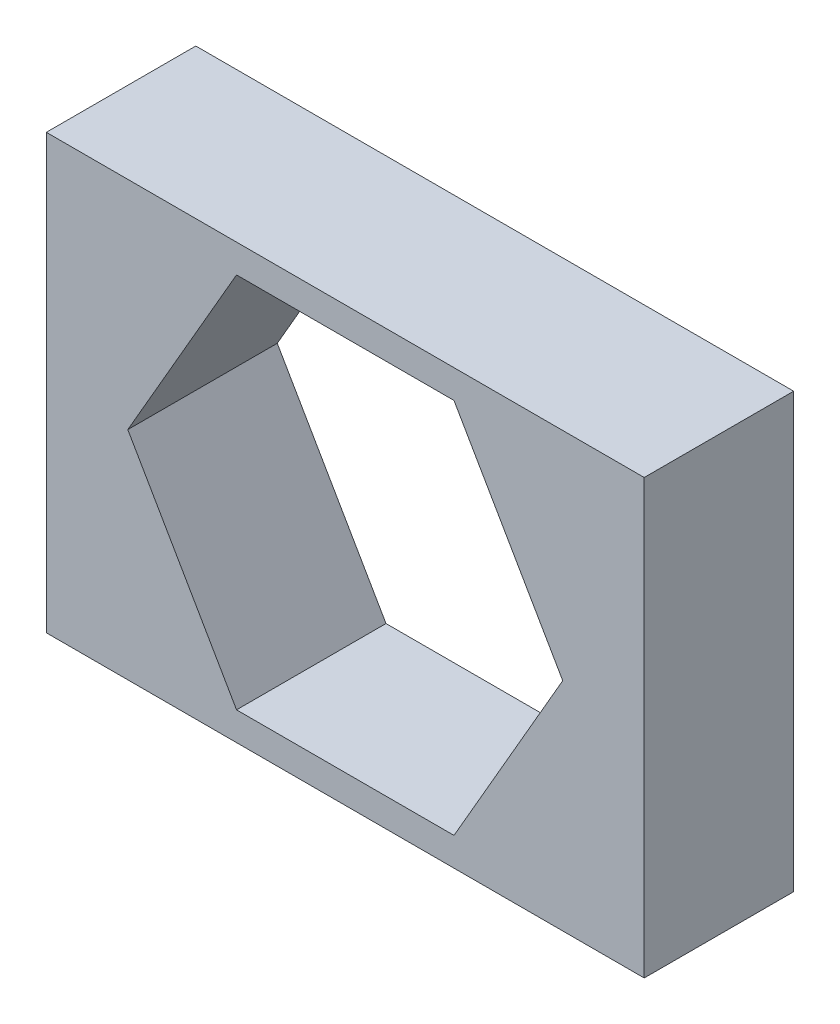
ISO-10303-21;
HEADER;
FILE_DESCRIPTION(('STEP AP214'),'2;1');
FILE_NAME('part.step','',(''),(''),'','','');
FILE_SCHEMA(('AUTOMOTIVE_DESIGN { 1 0 10303 214 1 1 1 1 }'));
ENDSEC;
DATA;
#1=APPLICATION_CONTEXT('core data for automotive mechanical design processes');
#2=APPLICATION_PROTOCOL_DEFINITION('international standard','automotive_design',2000,#1);
#3=PRODUCT_CONTEXT('',#1,'mechanical');
#4=PRODUCT('Part','Part','',(#3));
#5=PRODUCT_RELATED_PRODUCT_CATEGORY('part','',(#4));
#6=PRODUCT_DEFINITION_FORMATION('','',#4);
#7=PRODUCT_DEFINITION_CONTEXT('part definition',#1,'design');
#8=PRODUCT_DEFINITION('design','',#6,#7);
#9=PRODUCT_DEFINITION_SHAPE('','',#8);
#10=(LENGTH_UNIT() NAMED_UNIT(*) SI_UNIT(.MILLI.,.METRE.));
#11=(NAMED_UNIT(*) PLANE_ANGLE_UNIT() SI_UNIT($,.RADIAN.));
#12=(NAMED_UNIT(*) SI_UNIT($,.STERADIAN.) SOLID_ANGLE_UNIT());
#13=UNCERTAINTY_MEASURE_WITH_UNIT(LENGTH_MEASURE(1.E-05),#10,'distance_accuracy_value','');
#14=(GEOMETRIC_REPRESENTATION_CONTEXT(3) GLOBAL_UNCERTAINTY_ASSIGNED_CONTEXT((#13)) GLOBAL_UNIT_ASSIGNED_CONTEXT((#10,
#11,#12)) REPRESENTATION_CONTEXT('',''));
#15=CARTESIAN_POINT('',(0.,0.,0.));
#16=DIRECTION('',(0.,0.,1.));
#17=DIRECTION('',(1.,0.,0.));
#18=AXIS2_PLACEMENT_3D('',#15,#16,#17);
#19=CARTESIAN_POINT('',(0.,0.,5.));
#20=DIRECTION('',(0.,0.,-1.));
#21=DIRECTION('',(-1.,0.,0.));
#22=AXIS2_PLACEMENT_3D('',#19,#20,#21);
#23=PLANE('',#22);
#24=DIRECTION('',(0.,-1.,0.));
#25=VECTOR('',#24,1.);
#26=CARTESIAN_POINT('',(0.,0.,5.));
#27=LINE('',#26,#25);
#28=CARTESIAN_POINT('',(0.,14.5,5.));
#29=VERTEX_POINT('',#28);
#30=CARTESIAN_POINT('',(0.,0.,5.));
#31=VERTEX_POINT('',#30);
#32=EDGE_CURVE('E161',#29,#31,#27,.T.);
#33=ORIENTED_EDGE('',*,*,#32,.T.);
#34=DIRECTION('',(1.,0.,0.));
#35=VECTOR('',#34,1.);
#36=CARTESIAN_POINT('',(0.,0.,5.));
#37=LINE('',#36,#35);
#38=CARTESIAN_POINT('',(20.,0.,5.));
#39=VERTEX_POINT('',#38);
#40=EDGE_CURVE('E164',#31,#39,#37,.T.);
#41=ORIENTED_EDGE('',*,*,#40,.T.);
#42=DIRECTION('',(0.,1.,0.));
#43=VECTOR('',#42,1.);
#44=CARTESIAN_POINT('',(20.,0.,5.));
#45=LINE('',#44,#43);
#46=CARTESIAN_POINT('',(20.,14.5,5.));
#47=VERTEX_POINT('',#46);
#48=EDGE_CURVE('E167',#39,#47,#45,.T.);
#49=ORIENTED_EDGE('',*,*,#48,.T.);
#50=DIRECTION('',(-1.,0.,0.));
#51=VECTOR('',#50,1.);
#52=CARTESIAN_POINT('',(0.,14.5,5.));
#53=LINE('',#52,#51);
#54=EDGE_CURVE('E169',#47,#29,#53,.T.);
#55=ORIENTED_EDGE('',*,*,#54,.T.);
#56=EDGE_LOOP('',(#33,#41,#49,#55));
#57=FACE_BOUND('',#56,.T.);
#58=DIRECTION('',(0.5,0.866025403784439,0.));
#59=VECTOR('',#58,1.);
#60=CARTESIAN_POINT('',(13.6373066958946,0.949999999999997,5.));
#61=LINE('',#60,#59);
#62=CARTESIAN_POINT('',(13.6373066958946,0.949999999999997,5.));
#63=VERTEX_POINT('',#62);
#64=CARTESIAN_POINT('',(17.2746133917893,7.25,5.));
#65=VERTEX_POINT('',#64);
#66=EDGE_CURVE('E110',#63,#65,#61,.T.);
#67=ORIENTED_EDGE('',*,*,#66,.F.);
#68=DIRECTION('',(1.,0.,0.));
#69=VECTOR('',#68,1.);
#70=CARTESIAN_POINT('',(6.36269330410535,0.950000000000003,5.));
#71=LINE('',#70,#69);
#72=CARTESIAN_POINT('',(6.36269330410535,0.950000000000003,5.));
#73=VERTEX_POINT('',#72);
#74=EDGE_CURVE('E139',#73,#63,#71,.T.);
#75=ORIENTED_EDGE('',*,*,#74,.F.);
#76=DIRECTION('',(0.5,-0.866025403784439,0.));
#77=VECTOR('',#76,1.);
#78=CARTESIAN_POINT('',(2.72538660821072,7.25,5.));
#79=LINE('',#78,#77);
#80=CARTESIAN_POINT('',(2.72538660821072,7.25,5.));
#81=VERTEX_POINT('',#80);
#82=EDGE_CURVE('E137',#81,#73,#79,.T.);
#83=ORIENTED_EDGE('',*,*,#82,.F.);
#84=DIRECTION('',(-0.5,-0.866025403784438,0.));
#85=VECTOR('',#84,1.);
#86=CARTESIAN_POINT('',(6.36269330410536,13.55,5.));
#87=LINE('',#86,#85);
#88=CARTESIAN_POINT('',(6.36269330410536,13.55,5.));
#89=VERTEX_POINT('',#88);
#90=EDGE_CURVE('E133',#89,#81,#87,.T.);
#91=ORIENTED_EDGE('',*,*,#90,.F.);
#92=DIRECTION('',(-1.,0.,0.));
#93=VECTOR('',#92,1.);
#94=CARTESIAN_POINT('',(13.6373066958946,13.55,5.));
#95=LINE('',#94,#93);
#96=CARTESIAN_POINT('',(13.6373066958946,13.55,5.));
#97=VERTEX_POINT('',#96);
#98=EDGE_CURVE('E131',#97,#89,#95,.T.);
#99=ORIENTED_EDGE('',*,*,#98,.F.);
#100=DIRECTION('',(-0.5,0.866025403784439,0.));
#101=VECTOR('',#100,1.);
#102=CARTESIAN_POINT('',(17.2746133917893,7.25,5.));
#103=LINE('',#102,#101);
#104=EDGE_CURVE('E118',#65,#97,#103,.T.);
#105=ORIENTED_EDGE('',*,*,#104,.F.);
#106=EDGE_LOOP('',(#67,#75,#83,#91,#99,#105));
#107=FACE_BOUND('',#106,.T.);
#108=ADVANCED_FACE('F33',(#57,#107),#23,.F.);
#109=CARTESIAN_POINT('',(0.,0.,0.));
#110=DIRECTION('',(0.,0.,-1.));
#111=DIRECTION('',(-1.,0.,0.));
#112=AXIS2_PLACEMENT_3D('',#109,#110,#111);
#113=PLANE('',#112);
#114=DIRECTION('',(0.,-1.,0.));
#115=VECTOR('',#114,1.);
#116=CARTESIAN_POINT('',(0.,0.,0.));
#117=LINE('',#116,#115);
#118=CARTESIAN_POINT('',(0.,14.5,0.));
#119=VERTEX_POINT('',#118);
#120=CARTESIAN_POINT('',(0.,0.,0.));
#121=VERTEX_POINT('',#120);
#122=EDGE_CURVE('E126',#119,#121,#117,.T.);
#123=ORIENTED_EDGE('',*,*,#122,.F.);
#124=DIRECTION('',(-1.,0.,0.));
#125=VECTOR('',#124,1.);
#126=CARTESIAN_POINT('',(0.,14.5,0.));
#127=LINE('',#126,#125);
#128=CARTESIAN_POINT('',(20.,14.5,0.));
#129=VERTEX_POINT('',#128);
#130=EDGE_CURVE('E165',#129,#119,#127,.T.);
#131=ORIENTED_EDGE('',*,*,#130,.F.);
#132=DIRECTION('',(0.,1.,0.));
#133=VECTOR('',#132,1.);
#134=CARTESIAN_POINT('',(20.,0.,0.));
#135=LINE('',#134,#133);
#136=CARTESIAN_POINT('',(20.,0.,0.));
#137=VERTEX_POINT('',#136);
#138=EDGE_CURVE('E176',#137,#129,#135,.T.);
#139=ORIENTED_EDGE('',*,*,#138,.F.);
#140=DIRECTION('',(1.,0.,0.));
#141=VECTOR('',#140,1.);
#142=CARTESIAN_POINT('',(0.,0.,0.));
#143=LINE('',#142,#141);
#144=EDGE_CURVE('E174',#121,#137,#143,.T.);
#145=ORIENTED_EDGE('',*,*,#144,.F.);
#146=EDGE_LOOP('',(#123,#131,#139,#145));
#147=FACE_BOUND('',#146,.T.);
#148=DIRECTION('',(1.,0.,0.));
#149=VECTOR('',#148,1.);
#150=CARTESIAN_POINT('',(6.36269330410535,0.950000000000003,0.));
#151=LINE('',#150,#149);
#152=CARTESIAN_POINT('',(6.36269330410535,0.950000000000003,0.));
#153=VERTEX_POINT('',#152);
#154=CARTESIAN_POINT('',(13.6373066958946,0.949999999999997,0.));
#155=VERTEX_POINT('',#154);
#156=EDGE_CURVE('E119',#153,#155,#151,.T.);
#157=ORIENTED_EDGE('',*,*,#156,.T.);
#158=DIRECTION('',(0.5,0.866025403784439,0.));
#159=VECTOR('',#158,1.);
#160=CARTESIAN_POINT('',(13.6373066958946,0.949999999999997,0.));
#161=LINE('',#160,#159);
#162=CARTESIAN_POINT('',(17.2746133917893,7.25,0.));
#163=VERTEX_POINT('',#162);
#164=EDGE_CURVE('E56',#155,#163,#161,.T.);
#165=ORIENTED_EDGE('',*,*,#164,.T.);
#166=DIRECTION('',(-0.5,0.866025403784439,0.));
#167=VECTOR('',#166,1.);
#168=CARTESIAN_POINT('',(17.2746133917893,7.25,0.));
#169=LINE('',#168,#167);
#170=CARTESIAN_POINT('',(13.6373066958946,13.55,0.));
#171=VERTEX_POINT('',#170);
#172=EDGE_CURVE('E125',#163,#171,#169,.T.);
#173=ORIENTED_EDGE('',*,*,#172,.T.);
#174=DIRECTION('',(-1.,0.,0.));
#175=VECTOR('',#174,1.);
#176=CARTESIAN_POINT('',(13.6373066958946,13.55,0.));
#177=LINE('',#176,#175);
#178=CARTESIAN_POINT('',(6.36269330410536,13.55,0.));
#179=VERTEX_POINT('',#178);
#180=EDGE_CURVE('E143',#171,#179,#177,.T.);
#181=ORIENTED_EDGE('',*,*,#180,.T.);
#182=DIRECTION('',(-0.5,-0.866025403784438,0.));
#183=VECTOR('',#182,1.);
#184=CARTESIAN_POINT('',(6.36269330410536,13.55,0.));
#185=LINE('',#184,#183);
#186=CARTESIAN_POINT('',(2.72538660821072,7.25,0.));
#187=VERTEX_POINT('',#186);
#188=EDGE_CURVE('E146',#179,#187,#185,.T.);
#189=ORIENTED_EDGE('',*,*,#188,.T.);
#190=DIRECTION('',(0.5,-0.866025403784439,0.));
#191=VECTOR('',#190,1.);
#192=CARTESIAN_POINT('',(2.72538660821072,7.25,0.));
#193=LINE('',#192,#191);
#194=EDGE_CURVE('E149',#187,#153,#193,.T.);
#195=ORIENTED_EDGE('',*,*,#194,.T.);
#196=EDGE_LOOP('',(#157,#165,#173,#181,#189,#195));
#197=FACE_BOUND('',#196,.T.);
#198=ADVANCED_FACE('F194',(#147,#197),#113,.T.);
#199=CARTESIAN_POINT('',(0.,0.,5.));
#200=DIRECTION('',(1.,0.,0.));
#201=DIRECTION('',(0.,1.,0.));
#202=AXIS2_PLACEMENT_3D('',#199,#200,#201);
#203=PLANE('',#202);
#204=ORIENTED_EDGE('',*,*,#122,.T.);
#205=DIRECTION('',(0.,0.,-1.));
#206=VECTOR('',#205,1.);
#207=CARTESIAN_POINT('',(0.,0.,5.));
#208=LINE('',#207,#206);
#209=EDGE_CURVE('E11',#31,#121,#208,.T.);
#210=ORIENTED_EDGE('',*,*,#209,.F.);
#211=ORIENTED_EDGE('',*,*,#32,.F.);
#212=DIRECTION('',(0.,0.,-1.));
#213=VECTOR('',#212,1.);
#214=CARTESIAN_POINT('',(0.,14.5,5.));
#215=LINE('',#214,#213);
#216=EDGE_CURVE('E171',#29,#119,#215,.T.);
#217=ORIENTED_EDGE('',*,*,#216,.T.);
#218=EDGE_LOOP('',(#204,#210,#211,#217));
#219=FACE_BOUND('',#218,.T.);
#220=ADVANCED_FACE('F35',(#219),#203,.F.);
#221=CARTESIAN_POINT('',(0.,0.,5.));
#222=DIRECTION('',(0.,1.,0.));
#223=DIRECTION('',(-1.,0.,0.));
#224=AXIS2_PLACEMENT_3D('',#221,#222,#223);
#225=PLANE('',#224);
#226=ORIENTED_EDGE('',*,*,#144,.T.);
#227=DIRECTION('',(0.,0.,-1.));
#228=VECTOR('',#227,1.);
#229=CARTESIAN_POINT('',(20.,0.,5.));
#230=LINE('',#229,#228);
#231=EDGE_CURVE('E41',#39,#137,#230,.T.);
#232=ORIENTED_EDGE('',*,*,#231,.F.);
#233=ORIENTED_EDGE('',*,*,#40,.F.);
#234=ORIENTED_EDGE('',*,*,#209,.T.);
#235=EDGE_LOOP('',(#226,#232,#233,#234));
#236=FACE_BOUND('',#235,.T.);
#237=ADVANCED_FACE('F204',(#236),#225,.F.);
#238=CARTESIAN_POINT('',(20.,0.,5.));
#239=DIRECTION('',(-1.,0.,0.));
#240=DIRECTION('',(0.,0.,1.));
#241=AXIS2_PLACEMENT_3D('',#238,#239,#240);
#242=PLANE('',#241);
#243=ORIENTED_EDGE('',*,*,#138,.T.);
#244=DIRECTION('',(0.,0.,-1.));
#245=VECTOR('',#244,1.);
#246=CARTESIAN_POINT('',(20.,14.5,5.));
#247=LINE('',#246,#245);
#248=EDGE_CURVE('E181',#47,#129,#247,.T.);
#249=ORIENTED_EDGE('',*,*,#248,.F.);
#250=ORIENTED_EDGE('',*,*,#48,.F.);
#251=ORIENTED_EDGE('',*,*,#231,.T.);
#252=EDGE_LOOP('',(#243,#249,#250,#251));
#253=FACE_BOUND('',#252,.T.);
#254=ADVANCED_FACE('F188',(#253),#242,.F.);
#255=CARTESIAN_POINT('',(0.,14.5,5.));
#256=DIRECTION('',(0.,-1.,0.));
#257=DIRECTION('',(0.,0.,-1.));
#258=AXIS2_PLACEMENT_3D('',#255,#256,#257);
#259=PLANE('',#258);
#260=ORIENTED_EDGE('',*,*,#130,.T.);
#261=ORIENTED_EDGE('',*,*,#216,.F.);
#262=ORIENTED_EDGE('',*,*,#54,.F.);
#263=ORIENTED_EDGE('',*,*,#248,.T.);
#264=EDGE_LOOP('',(#260,#261,#262,#263));
#265=FACE_BOUND('',#264,.T.);
#266=ADVANCED_FACE('F198',(#265),#259,.F.);
#267=CARTESIAN_POINT('',(13.6373066958946,0.949999999999997,5.));
#268=DIRECTION('',(-0.866025403784439,0.5,0.));
#269=DIRECTION('',(-0.5,-0.866025403784439,0.));
#270=AXIS2_PLACEMENT_3D('',#267,#268,#269);
#271=PLANE('',#270);
#272=ORIENTED_EDGE('',*,*,#164,.F.);
#273=DIRECTION('',(0.,0.,-1.));
#274=VECTOR('',#273,1.);
#275=CARTESIAN_POINT('',(13.6373066958946,0.949999999999997,5.));
#276=LINE('',#275,#274);
#277=EDGE_CURVE('E114',#63,#155,#276,.T.);
#278=ORIENTED_EDGE('',*,*,#277,.F.);
#279=ORIENTED_EDGE('',*,*,#66,.T.);
#280=DIRECTION('',(0.,0.,-1.));
#281=VECTOR('',#280,1.);
#282=CARTESIAN_POINT('',(17.2746133917893,7.25,5.));
#283=LINE('',#282,#281);
#284=EDGE_CURVE('E113',#65,#163,#283,.T.);
#285=ORIENTED_EDGE('',*,*,#284,.T.);
#286=EDGE_LOOP('',(#272,#278,#279,#285));
#287=FACE_BOUND('',#286,.T.);
#288=ADVANCED_FACE('F112',(#287),#271,.T.);
#289=CARTESIAN_POINT('',(17.2746133917893,7.25,5.));
#290=DIRECTION('',(-0.866025403784439,-0.5,0.));
#291=DIRECTION('',(0.5,-0.866025403784439,0.));
#292=AXIS2_PLACEMENT_3D('',#289,#290,#291);
#293=PLANE('',#292);
#294=ORIENTED_EDGE('',*,*,#172,.F.);
#295=ORIENTED_EDGE('',*,*,#284,.F.);
#296=ORIENTED_EDGE('',*,*,#104,.T.);
#297=DIRECTION('',(0.,0.,-1.));
#298=VECTOR('',#297,1.);
#299=CARTESIAN_POINT('',(13.6373066958946,13.55,5.));
#300=LINE('',#299,#298);
#301=EDGE_CURVE('E127',#97,#171,#300,.T.);
#302=ORIENTED_EDGE('',*,*,#301,.T.);
#303=EDGE_LOOP('',(#294,#295,#296,#302));
#304=FACE_BOUND('',#303,.T.);
#305=ADVANCED_FACE('F122',(#304),#293,.T.);
#306=CARTESIAN_POINT('',(13.6373066958946,13.55,5.));
#307=DIRECTION('',(0.,-1.,0.));
#308=DIRECTION('',(1.,0.,0.));
#309=AXIS2_PLACEMENT_3D('',#306,#307,#308);
#310=PLANE('',#309);
#311=ORIENTED_EDGE('',*,*,#180,.F.);
#312=ORIENTED_EDGE('',*,*,#301,.F.);
#313=ORIENTED_EDGE('',*,*,#98,.T.);
#314=DIRECTION('',(0.,0.,-1.));
#315=VECTOR('',#314,1.);
#316=CARTESIAN_POINT('',(6.36269330410536,13.55,5.));
#317=LINE('',#316,#315);
#318=EDGE_CURVE('E158',#89,#179,#317,.T.);
#319=ORIENTED_EDGE('',*,*,#318,.T.);
#320=EDGE_LOOP('',(#311,#312,#313,#319));
#321=FACE_BOUND('',#320,.T.);
#322=ADVANCED_FACE('F227',(#321),#310,.T.);
#323=CARTESIAN_POINT('',(6.36269330410536,13.55,5.));
#324=DIRECTION('',(0.866025403784438,-0.5,0.));
#325=DIRECTION('',(0.5,0.866025403784438,0.));
#326=AXIS2_PLACEMENT_3D('',#323,#324,#325);
#327=PLANE('',#326);
#328=ORIENTED_EDGE('',*,*,#188,.F.);
#329=ORIENTED_EDGE('',*,*,#318,.F.);
#330=ORIENTED_EDGE('',*,*,#90,.T.);
#331=DIRECTION('',(0.,0.,-1.));
#332=VECTOR('',#331,1.);
#333=CARTESIAN_POINT('',(2.72538660821072,7.25,5.));
#334=LINE('',#333,#332);
#335=EDGE_CURVE('E156',#81,#187,#334,.T.);
#336=ORIENTED_EDGE('',*,*,#335,.T.);
#337=EDGE_LOOP('',(#328,#329,#330,#336));
#338=FACE_BOUND('',#337,.T.);
#339=ADVANCED_FACE('F231',(#338),#327,.T.);
#340=CARTESIAN_POINT('',(2.72538660821072,7.25,5.));
#341=DIRECTION('',(0.866025403784439,0.5,0.));
#342=DIRECTION('',(-0.5,0.866025403784439,0.));
#343=AXIS2_PLACEMENT_3D('',#340,#341,#342);
#344=PLANE('',#343);
#345=ORIENTED_EDGE('',*,*,#194,.F.);
#346=ORIENTED_EDGE('',*,*,#335,.F.);
#347=ORIENTED_EDGE('',*,*,#82,.T.);
#348=DIRECTION('',(0.,0.,-1.));
#349=VECTOR('',#348,1.);
#350=CARTESIAN_POINT('',(6.36269330410535,0.950000000000003,5.));
#351=LINE('',#350,#349);
#352=EDGE_CURVE('E48',#73,#153,#351,.T.);
#353=ORIENTED_EDGE('',*,*,#352,.T.);
#354=EDGE_LOOP('',(#345,#346,#347,#353));
#355=FACE_BOUND('',#354,.T.);
#356=ADVANCED_FACE('F237',(#355),#344,.T.);
#357=CARTESIAN_POINT('',(6.36269330410535,0.950000000000003,5.));
#358=DIRECTION('',(0.,1.,0.));
#359=DIRECTION('',(-1.,0.,0.));
#360=AXIS2_PLACEMENT_3D('',#357,#358,#359);
#361=PLANE('',#360);
#362=ORIENTED_EDGE('',*,*,#156,.F.);
#363=ORIENTED_EDGE('',*,*,#352,.F.);
#364=ORIENTED_EDGE('',*,*,#74,.T.);
#365=ORIENTED_EDGE('',*,*,#277,.T.);
#366=EDGE_LOOP('',(#362,#363,#364,#365));
#367=FACE_BOUND('',#366,.T.);
#368=ADVANCED_FACE('F241',(#367),#361,.T.);
#369=CLOSED_SHELL('',(#108,#198,#220,#237,#254,#266,#288,#305,#322,#339,#356,#368));
#370=MANIFOLD_SOLID_BREP('B2',#369);
#371=ADVANCED_BREP_SHAPE_REPRESENTATION('',(#18,#370),#14);
#372=SHAPE_DEFINITION_REPRESENTATION(#9,#371);
ENDSEC;
END-ISO-10303-21;
